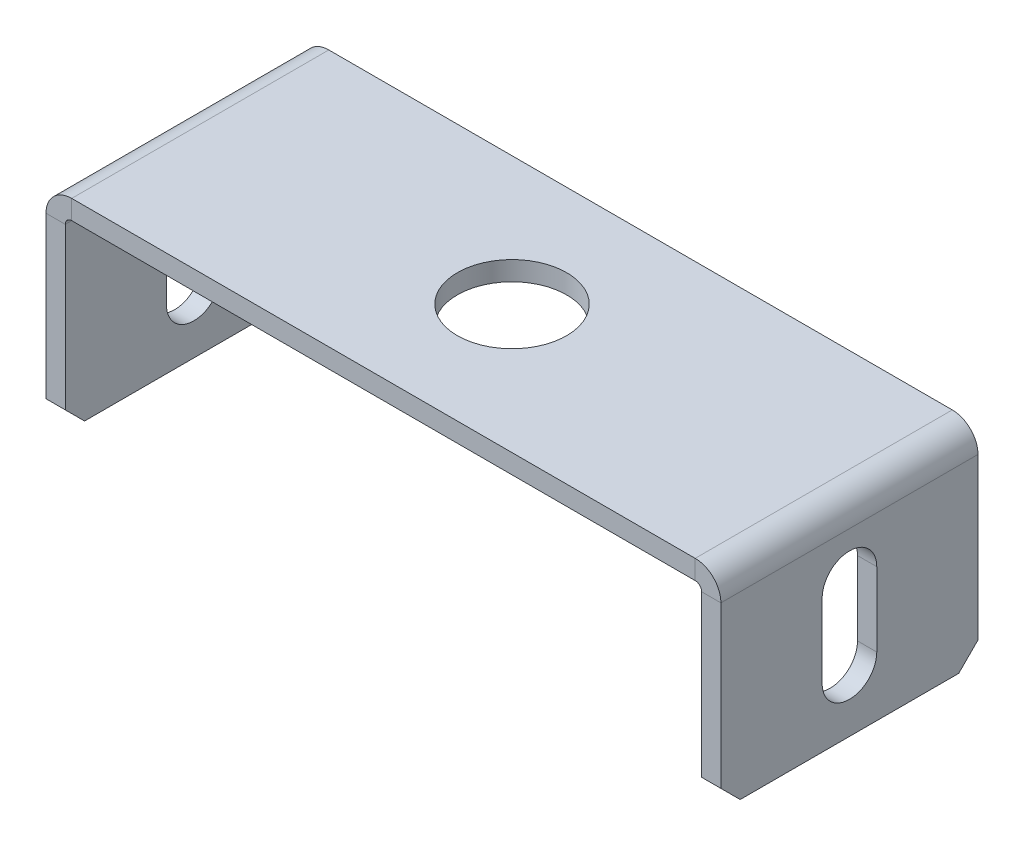
ISO-10303-21;
HEADER;
FILE_DESCRIPTION(('STEP AP214'),'2;1');
FILE_NAME('part.step','',(''),(''),'','','');
FILE_SCHEMA(('AUTOMOTIVE_DESIGN { 1 0 10303 214 1 1 1 1 }'));
ENDSEC;
DATA;
#1=APPLICATION_CONTEXT('core data for automotive mechanical design processes');
#2=APPLICATION_PROTOCOL_DEFINITION('international standard','automotive_design',2000,#1);
#3=PRODUCT_CONTEXT('',#1,'mechanical');
#4=PRODUCT('Part','Part','',(#3));
#5=PRODUCT_RELATED_PRODUCT_CATEGORY('part','',(#4));
#6=PRODUCT_DEFINITION_FORMATION('','',#4);
#7=PRODUCT_DEFINITION_CONTEXT('part definition',#1,'design');
#8=PRODUCT_DEFINITION('design','',#6,#7);
#9=PRODUCT_DEFINITION_SHAPE('','',#8);
#10=(LENGTH_UNIT() NAMED_UNIT(*) SI_UNIT(.MILLI.,.METRE.));
#11=(NAMED_UNIT(*) PLANE_ANGLE_UNIT() SI_UNIT($,.RADIAN.));
#12=(NAMED_UNIT(*) SI_UNIT($,.STERADIAN.) SOLID_ANGLE_UNIT());
#13=UNCERTAINTY_MEASURE_WITH_UNIT(LENGTH_MEASURE(1.E-05),#10,'distance_accuracy_value','');
#14=(GEOMETRIC_REPRESENTATION_CONTEXT(3) GLOBAL_UNCERTAINTY_ASSIGNED_CONTEXT((#13)) GLOBAL_UNIT_ASSIGNED_CONTEXT((#10,
#11,#12)) REPRESENTATION_CONTEXT('',''));
#15=CARTESIAN_POINT('',(0.,0.,0.));
#16=DIRECTION('',(0.,0.,1.));
#17=DIRECTION('',(1.,0.,0.));
#18=AXIS2_PLACEMENT_3D('',#15,#16,#17);
#19=CARTESIAN_POINT('',(-48.5,0.,20.));
#20=DIRECTION('',(0.,0.,1.));
#21=DIRECTION('',(1.,0.,0.));
#22=AXIS2_PLACEMENT_3D('',#19,#20,#21);
#23=PLANE('',#22);
#24=DIRECTION('',(0.,-1.,0.));
#25=VECTOR('',#24,1.);
#26=CARTESIAN_POINT('',(-48.5,0.,20.));
#27=LINE('',#26,#25);
#28=CARTESIAN_POINT('',(-48.5,0.,20.));
#29=VERTEX_POINT('',#28);
#30=CARTESIAN_POINT('',(-48.5,-3.,20.));
#31=VERTEX_POINT('',#30);
#32=EDGE_CURVE('E431',#29,#31,#27,.T.);
#33=ORIENTED_EDGE('',*,*,#32,.F.);
#34=CARTESIAN_POINT('',(-48.5,-4.,20.));
#35=DIRECTION('',(0.,0.,1.));
#36=DIRECTION('',(1.,0.,0.));
#37=AXIS2_PLACEMENT_3D('',#34,#35,#36);
#38=CIRCLE('',#37,4.);
#39=CARTESIAN_POINT('',(-52.5,-4.,20.));
#40=VERTEX_POINT('',#39);
#41=EDGE_CURVE('E341',#40,#29,#38,.F.);
#42=ORIENTED_EDGE('',*,*,#41,.F.);
#43=DIRECTION('',(-1.,0.,0.));
#44=VECTOR('',#43,1.);
#45=CARTESIAN_POINT('',(-49.5,-4.,20.));
#46=LINE('',#45,#44);
#47=CARTESIAN_POINT('',(-49.5,-4.,20.));
#48=VERTEX_POINT('',#47);
#49=EDGE_CURVE('E428',#48,#40,#46,.T.);
#50=ORIENTED_EDGE('',*,*,#49,.F.);
#51=CARTESIAN_POINT('',(-48.5,-4.,20.));
#52=DIRECTION('',(0.,0.,1.));
#53=DIRECTION('',(1.,0.,0.));
#54=AXIS2_PLACEMENT_3D('',#51,#52,#53);
#55=CIRCLE('',#54,1.);
#56=EDGE_CURVE('E348',#48,#31,#55,.F.);
#57=ORIENTED_EDGE('',*,*,#56,.T.);
#58=EDGE_LOOP('',(#33,#42,#50,#57));
#59=FACE_BOUND('',#58,.T.);
#60=ADVANCED_FACE('F112',(#59),#23,.T.);
#61=CARTESIAN_POINT('',(-49.5,-4.,20.));
#62=DIRECTION('',(0.,0.,1.));
#63=DIRECTION('',(1.,0.,0.));
#64=AXIS2_PLACEMENT_3D('',#61,#62,#63);
#65=PLANE('',#64);
#66=DIRECTION('',(1.,0.,0.));
#67=VECTOR('',#66,1.);
#68=CARTESIAN_POINT('',(-52.5,0.,20.));
#69=LINE('',#68,#67);
#70=CARTESIAN_POINT('',(48.5,0.,20.));
#71=VERTEX_POINT('',#70);
#72=EDGE_CURVE('E338',#29,#71,#69,.T.);
#73=ORIENTED_EDGE('',*,*,#72,.F.);
#74=ORIENTED_EDGE('',*,*,#32,.T.);
#75=DIRECTION('',(1.,0.,0.));
#76=VECTOR('',#75,1.);
#77=CARTESIAN_POINT('',(-52.5,-3.,20.));
#78=LINE('',#77,#76);
#79=CARTESIAN_POINT('',(48.5,-3.,20.));
#80=VERTEX_POINT('',#79);
#81=EDGE_CURVE('E351',#31,#80,#78,.T.);
#82=ORIENTED_EDGE('',*,*,#81,.T.);
#83=DIRECTION('',(0.,1.,0.));
#84=VECTOR('',#83,1.);
#85=CARTESIAN_POINT('',(48.5,-3.,20.));
#86=LINE('',#85,#84);
#87=EDGE_CURVE('E419',#80,#71,#86,.T.);
#88=ORIENTED_EDGE('',*,*,#87,.T.);
#89=EDGE_LOOP('',(#73,#74,#82,#88));
#90=FACE_BOUND('',#89,.T.);
#91=ADVANCED_FACE('F525',(#90),#65,.T.);
#92=CARTESIAN_POINT('',(-52.5,-4.,-20.));
#93=DIRECTION('',(0.,0.,-1.));
#94=DIRECTION('',(-1.,0.,0.));
#95=AXIS2_PLACEMENT_3D('',#92,#93,#94);
#96=PLANE('',#95);
#97=DIRECTION('',(1.,0.,0.));
#98=VECTOR('',#97,1.);
#99=CARTESIAN_POINT('',(-52.5,-4.,-20.));
#100=LINE('',#99,#98);
#101=CARTESIAN_POINT('',(-52.5,-4.,-20.));
#102=VERTEX_POINT('',#101);
#103=CARTESIAN_POINT('',(-49.5,-4.,-20.));
#104=VERTEX_POINT('',#103);
#105=EDGE_CURVE('E425',#102,#104,#100,.T.);
#106=ORIENTED_EDGE('',*,*,#105,.F.);
#107=CARTESIAN_POINT('',(-48.5,-4.,-20.));
#108=DIRECTION('',(0.,0.,1.));
#109=DIRECTION('',(1.,0.,0.));
#110=AXIS2_PLACEMENT_3D('',#107,#108,#109);
#111=CIRCLE('',#110,4.);
#112=CARTESIAN_POINT('',(-48.5,0.,-20.));
#113=VERTEX_POINT('',#112);
#114=EDGE_CURVE('E369',#102,#113,#111,.F.);
#115=ORIENTED_EDGE('',*,*,#114,.T.);
#116=DIRECTION('',(0.,1.,0.));
#117=VECTOR('',#116,1.);
#118=CARTESIAN_POINT('',(-48.5,-3.,-20.));
#119=LINE('',#118,#117);
#120=CARTESIAN_POINT('',(-48.5,-3.,-20.));
#121=VERTEX_POINT('',#120);
#122=EDGE_CURVE('E423',#121,#113,#119,.T.);
#123=ORIENTED_EDGE('',*,*,#122,.F.);
#124=CARTESIAN_POINT('',(-48.5,-4.,-20.));
#125=DIRECTION('',(0.,0.,1.));
#126=DIRECTION('',(1.,0.,0.));
#127=AXIS2_PLACEMENT_3D('',#124,#125,#126);
#128=CIRCLE('',#127,1.);
#129=EDGE_CURVE('E376',#104,#121,#128,.F.);
#130=ORIENTED_EDGE('',*,*,#129,.F.);
#131=EDGE_LOOP('',(#106,#115,#123,#130));
#132=FACE_BOUND('',#131,.T.);
#133=ADVANCED_FACE('F514',(#132),#96,.T.);
#134=CARTESIAN_POINT('',(-48.5,-3.,-20.));
#135=DIRECTION('',(0.,0.,-1.));
#136=DIRECTION('',(-1.,0.,0.));
#137=AXIS2_PLACEMENT_3D('',#134,#135,#136);
#138=PLANE('',#137);
#139=DIRECTION('',(0.,1.,0.));
#140=VECTOR('',#139,1.);
#141=CARTESIAN_POINT('',(-49.5,-32.,-20.));
#142=LINE('',#141,#140);
#143=CARTESIAN_POINT('',(-49.5,-29.,-20.));
#144=VERTEX_POINT('',#143);
#145=EDGE_CURVE('E374',#144,#104,#142,.T.);
#146=ORIENTED_EDGE('',*,*,#145,.F.);
#147=DIRECTION('',(-1.,0.,0.));
#148=VECTOR('',#147,1.);
#149=CARTESIAN_POINT('',(-48.5,-29.,-20.));
#150=LINE('',#149,#148);
#151=CARTESIAN_POINT('',(-52.5,-29.,-20.));
#152=VERTEX_POINT('',#151);
#153=EDGE_CURVE('E453',#144,#152,#150,.T.);
#154=ORIENTED_EDGE('',*,*,#153,.T.);
#155=DIRECTION('',(0.,1.,0.));
#156=VECTOR('',#155,1.);
#157=CARTESIAN_POINT('',(-52.5,-32.,-20.));
#158=LINE('',#157,#156);
#159=EDGE_CURVE('E372',#152,#102,#158,.T.);
#160=ORIENTED_EDGE('',*,*,#159,.T.);
#161=ORIENTED_EDGE('',*,*,#105,.T.);
#162=EDGE_LOOP('',(#146,#154,#160,#161));
#163=FACE_BOUND('',#162,.T.);
#164=ADVANCED_FACE('F601',(#163),#138,.T.);
#165=CARTESIAN_POINT('',(52.5,-4.,20.));
#166=DIRECTION('',(0.,0.,1.));
#167=DIRECTION('',(1.,0.,0.));
#168=AXIS2_PLACEMENT_3D('',#165,#166,#167);
#169=PLANE('',#168);
#170=DIRECTION('',(-1.,0.,0.));
#171=VECTOR('',#170,1.);
#172=CARTESIAN_POINT('',(52.5,-4.,20.));
#173=LINE('',#172,#171);
#174=CARTESIAN_POINT('',(52.5,-4.,20.));
#175=VERTEX_POINT('',#174);
#176=CARTESIAN_POINT('',(49.5,-4.,20.));
#177=VERTEX_POINT('',#176);
#178=EDGE_CURVE('E421',#175,#177,#173,.T.);
#179=ORIENTED_EDGE('',*,*,#178,.F.);
#180=CARTESIAN_POINT('',(48.5,-4.,20.));
#181=DIRECTION('',(0.,0.,1.));
#182=DIRECTION('',(1.,0.,0.));
#183=AXIS2_PLACEMENT_3D('',#180,#181,#182);
#184=CIRCLE('',#183,4.);
#185=EDGE_CURVE('E335',#71,#175,#184,.F.);
#186=ORIENTED_EDGE('',*,*,#185,.F.);
#187=ORIENTED_EDGE('',*,*,#87,.F.);
#188=CARTESIAN_POINT('',(48.5,-4.,20.));
#189=DIRECTION('',(0.,0.,1.));
#190=DIRECTION('',(1.,0.,0.));
#191=AXIS2_PLACEMENT_3D('',#188,#189,#190);
#192=CIRCLE('',#191,1.);
#193=EDGE_CURVE('E354',#80,#177,#192,.F.);
#194=ORIENTED_EDGE('',*,*,#193,.T.);
#195=EDGE_LOOP('',(#179,#186,#187,#194));
#196=FACE_BOUND('',#195,.T.);
#197=ADVANCED_FACE('F531',(#196),#169,.T.);
#198=CARTESIAN_POINT('',(48.5,-3.,20.));
#199=DIRECTION('',(0.,0.,1.));
#200=DIRECTION('',(1.,0.,0.));
#201=AXIS2_PLACEMENT_3D('',#198,#199,#200);
#202=PLANE('',#201);
#203=DIRECTION('',(0.,-1.,0.));
#204=VECTOR('',#203,1.);
#205=CARTESIAN_POINT('',(49.5,0.,20.));
#206=LINE('',#205,#204);
#207=CARTESIAN_POINT('',(49.5,-29.,20.));
#208=VERTEX_POINT('',#207);
#209=EDGE_CURVE('E328',#177,#208,#206,.T.);
#210=ORIENTED_EDGE('',*,*,#209,.T.);
#211=DIRECTION('',(1.,0.,0.));
#212=VECTOR('',#211,1.);
#213=CARTESIAN_POINT('',(48.5,-29.,20.));
#214=LINE('',#213,#212);
#215=CARTESIAN_POINT('',(52.5,-29.,20.));
#216=VERTEX_POINT('',#215);
#217=EDGE_CURVE('E449',#208,#216,#214,.T.);
#218=ORIENTED_EDGE('',*,*,#217,.T.);
#219=DIRECTION('',(0.,-1.,0.));
#220=VECTOR('',#219,1.);
#221=CARTESIAN_POINT('',(52.5,0.,20.));
#222=LINE('',#221,#220);
#223=EDGE_CURVE('E331',#175,#216,#222,.T.);
#224=ORIENTED_EDGE('',*,*,#223,.F.);
#225=ORIENTED_EDGE('',*,*,#178,.T.);
#226=EDGE_LOOP('',(#210,#218,#224,#225));
#227=FACE_BOUND('',#226,.T.);
#228=ADVANCED_FACE('F541',(#227),#202,.T.);
#229=CARTESIAN_POINT('',(48.5,0.,-20.));
#230=DIRECTION('',(0.,0.,-1.));
#231=DIRECTION('',(-1.,0.,0.));
#232=AXIS2_PLACEMENT_3D('',#229,#230,#231);
#233=PLANE('',#232);
#234=DIRECTION('',(0.,-1.,0.));
#235=VECTOR('',#234,1.);
#236=CARTESIAN_POINT('',(48.5,0.,-20.));
#237=LINE('',#236,#235);
#238=CARTESIAN_POINT('',(48.5,0.,-20.));
#239=VERTEX_POINT('',#238);
#240=CARTESIAN_POINT('',(48.5,-3.,-20.));
#241=VERTEX_POINT('',#240);
#242=EDGE_CURVE('E417',#239,#241,#237,.T.);
#243=ORIENTED_EDGE('',*,*,#242,.F.);
#244=CARTESIAN_POINT('',(48.5,-4.,-20.));
#245=DIRECTION('',(0.,0.,1.));
#246=DIRECTION('',(1.,0.,0.));
#247=AXIS2_PLACEMENT_3D('',#244,#245,#246);
#248=CIRCLE('',#247,4.);
#249=CARTESIAN_POINT('',(52.5,-4.,-20.));
#250=VERTEX_POINT('',#249);
#251=EDGE_CURVE('E363',#239,#250,#248,.F.);
#252=ORIENTED_EDGE('',*,*,#251,.T.);
#253=DIRECTION('',(1.,0.,0.));
#254=VECTOR('',#253,1.);
#255=CARTESIAN_POINT('',(49.5,-4.,-20.));
#256=LINE('',#255,#254);
#257=CARTESIAN_POINT('',(49.5,-4.,-20.));
#258=VERTEX_POINT('',#257);
#259=EDGE_CURVE('E415',#258,#250,#256,.T.);
#260=ORIENTED_EDGE('',*,*,#259,.F.);
#261=CARTESIAN_POINT('',(48.5,-4.,-20.));
#262=DIRECTION('',(0.,0.,1.));
#263=DIRECTION('',(1.,0.,0.));
#264=AXIS2_PLACEMENT_3D('',#261,#262,#263);
#265=CIRCLE('',#264,1.);
#266=EDGE_CURVE('E332',#241,#258,#265,.F.);
#267=ORIENTED_EDGE('',*,*,#266,.F.);
#268=EDGE_LOOP('',(#243,#252,#260,#267));
#269=FACE_BOUND('',#268,.T.);
#270=ADVANCED_FACE('F561',(#269),#233,.T.);
#271=CARTESIAN_POINT('',(49.5,-4.,-20.));
#272=DIRECTION('',(0.,0.,-1.));
#273=DIRECTION('',(-1.,0.,0.));
#274=AXIS2_PLACEMENT_3D('',#271,#272,#273);
#275=PLANE('',#274);
#276=DIRECTION('',(1.,0.,0.));
#277=VECTOR('',#276,1.);
#278=CARTESIAN_POINT('',(-52.5,0.,-20.));
#279=LINE('',#278,#277);
#280=EDGE_CURVE('E366',#113,#239,#279,.T.);
#281=ORIENTED_EDGE('',*,*,#280,.T.);
#282=ORIENTED_EDGE('',*,*,#242,.T.);
#283=DIRECTION('',(1.,0.,0.));
#284=VECTOR('',#283,1.);
#285=CARTESIAN_POINT('',(-52.5,-3.,-20.));
#286=LINE('',#285,#284);
#287=EDGE_CURVE('E379',#121,#241,#286,.T.);
#288=ORIENTED_EDGE('',*,*,#287,.F.);
#289=ORIENTED_EDGE('',*,*,#122,.T.);
#290=EDGE_LOOP('',(#281,#282,#288,#289));
#291=FACE_BOUND('',#290,.T.);
#292=ADVANCED_FACE('F567',(#291),#275,.T.);
#293=CARTESIAN_POINT('',(49.5,0.,20.));
#294=DIRECTION('',(1.,0.,0.));
#295=DIRECTION('',(0.,1.,0.));
#296=AXIS2_PLACEMENT_3D('',#293,#294,#295);
#297=PLANE('',#296);
#298=CARTESIAN_POINT('',(49.5,-22.75,0.));
#299=DIRECTION('',(1.,0.,0.));
#300=DIRECTION('',(0.,1.,0.));
#301=AXIS2_PLACEMENT_3D('',#298,#299,#300);
#302=CIRCLE('',#301,4.24999999999999);
#303=CARTESIAN_POINT('',(49.5,-22.75,4.24999999999999));
#304=VERTEX_POINT('',#303);
#305=CARTESIAN_POINT('',(49.5,-22.75,-4.24999999999999));
#306=VERTEX_POINT('',#305);
#307=EDGE_CURVE('E324',#304,#306,#302,.T.);
#308=ORIENTED_EDGE('',*,*,#307,.T.);
#309=DIRECTION('',(0.,1.,0.));
#310=VECTOR('',#309,1.);
#311=CARTESIAN_POINT('',(49.5,0.,-4.24999999999999));
#312=LINE('',#311,#310);
#313=CARTESIAN_POINT('',(49.5,-11.25,-4.24999999999999));
#314=VERTEX_POINT('',#313);
#315=EDGE_CURVE('E315',#306,#314,#312,.T.);
#316=ORIENTED_EDGE('',*,*,#315,.T.);
#317=CARTESIAN_POINT('',(49.5,-11.25,0.));
#318=DIRECTION('',(1.,0.,0.));
#319=DIRECTION('',(0.,1.,0.));
#320=AXIS2_PLACEMENT_3D('',#317,#318,#319);
#321=CIRCLE('',#320,4.24999999999999);
#322=CARTESIAN_POINT('',(49.5,-11.25,4.24999999999999));
#323=VERTEX_POINT('',#322);
#324=EDGE_CURVE('E321',#314,#323,#321,.T.);
#325=ORIENTED_EDGE('',*,*,#324,.T.);
#326=DIRECTION('',(0.,-1.,0.));
#327=VECTOR('',#326,1.);
#328=CARTESIAN_POINT('',(49.5,0.,4.25));
#329=LINE('',#328,#327);
#330=EDGE_CURVE('E318',#323,#304,#329,.T.);
#331=ORIENTED_EDGE('',*,*,#330,.T.);
#332=EDGE_LOOP('',(#308,#316,#325,#331));
#333=FACE_BOUND('',#332,.T.);
#334=DIRECTION('',(0.,0.,-1.));
#335=VECTOR('',#334,1.);
#336=CARTESIAN_POINT('',(49.5,-32.,20.));
#337=LINE('',#336,#335);
#338=CARTESIAN_POINT('',(49.5,-32.,17.));
#339=VERTEX_POINT('',#338);
#340=CARTESIAN_POINT('',(49.5,-32.,-17.));
#341=VERTEX_POINT('',#340);
#342=EDGE_CURVE('E413',#339,#341,#337,.T.);
#343=ORIENTED_EDGE('',*,*,#342,.F.);
#344=DIRECTION('',(0.,-0.707106781186548,-0.707106781186548));
#345=VECTOR('',#344,1.);
#346=CARTESIAN_POINT('',(49.5,-32.,17.));
#347=LINE('',#346,#345);
#348=EDGE_CURVE('E447',#339,#208,#347,.F.);
#349=ORIENTED_EDGE('',*,*,#348,.T.);
#350=ORIENTED_EDGE('',*,*,#209,.F.);
#351=DIRECTION('',(0.,0.,-1.));
#352=VECTOR('',#351,1.);
#353=CARTESIAN_POINT('',(49.5,-4.,20.));
#354=LINE('',#353,#352);
#355=EDGE_CURVE('E357',#177,#258,#354,.T.);
#356=ORIENTED_EDGE('',*,*,#355,.T.);
#357=DIRECTION('',(0.,-1.,0.));
#358=VECTOR('',#357,1.);
#359=CARTESIAN_POINT('',(49.5,0.,-20.));
#360=LINE('',#359,#358);
#361=CARTESIAN_POINT('',(49.5,-29.,-20.));
#362=VERTEX_POINT('',#361);
#363=EDGE_CURVE('E327',#258,#362,#360,.T.);
#364=ORIENTED_EDGE('',*,*,#363,.T.);
#365=DIRECTION('',(0.,-0.707106781186548,0.707106781186547));
#366=VECTOR('',#365,1.);
#367=CARTESIAN_POINT('',(49.5,-29.,-20.));
#368=LINE('',#367,#366);
#369=EDGE_CURVE('E436',#362,#341,#368,.T.);
#370=ORIENTED_EDGE('',*,*,#369,.T.);
#371=EDGE_LOOP('',(#343,#349,#350,#356,#364,#370));
#372=FACE_BOUND('',#371,.T.);
#373=ADVANCED_FACE('F565',(#333,#372),#297,.F.);
#374=CARTESIAN_POINT('',(52.5,-32.,20.));
#375=DIRECTION('',(0.,-1.,0.));
#376=DIRECTION('',(0.,0.,-1.));
#377=AXIS2_PLACEMENT_3D('',#374,#375,#376);
#378=PLANE('',#377);
#379=DIRECTION('',(0.,0.,-1.));
#380=VECTOR('',#379,1.);
#381=CARTESIAN_POINT('',(52.5,-32.,20.));
#382=LINE('',#381,#380);
#383=CARTESIAN_POINT('',(52.5,-32.,17.));
#384=VERTEX_POINT('',#383);
#385=CARTESIAN_POINT('',(52.5,-32.,-17.));
#386=VERTEX_POINT('',#385);
#387=EDGE_CURVE('E411',#384,#386,#382,.T.);
#388=ORIENTED_EDGE('',*,*,#387,.F.);
#389=DIRECTION('',(-1.,0.,0.));
#390=VECTOR('',#389,1.);
#391=CARTESIAN_POINT('',(52.5,-32.,17.));
#392=LINE('',#391,#390);
#393=EDGE_CURVE('E444',#384,#339,#392,.T.);
#394=ORIENTED_EDGE('',*,*,#393,.T.);
#395=ORIENTED_EDGE('',*,*,#342,.T.);
#396=DIRECTION('',(1.,0.,0.));
#397=VECTOR('',#396,1.);
#398=CARTESIAN_POINT('',(52.5,-32.,-17.));
#399=LINE('',#398,#397);
#400=EDGE_CURVE('E439',#341,#386,#399,.T.);
#401=ORIENTED_EDGE('',*,*,#400,.T.);
#402=EDGE_LOOP('',(#388,#394,#395,#401));
#403=FACE_BOUND('',#402,.T.);
#404=ADVANCED_FACE('F549',(#403),#378,.T.);
#405=CARTESIAN_POINT('',(52.5,0.,20.));
#406=DIRECTION('',(1.,0.,0.));
#407=DIRECTION('',(0.,1.,0.));
#408=AXIS2_PLACEMENT_3D('',#405,#406,#407);
#409=PLANE('',#408);
#410=DIRECTION('',(0.,1.,0.));
#411=VECTOR('',#410,1.);
#412=CARTESIAN_POINT('',(52.5,-22.75,-4.25000000000001));
#413=LINE('',#412,#411);
#414=CARTESIAN_POINT('',(52.5,-22.75,-4.25));
#415=VERTEX_POINT('',#414);
#416=CARTESIAN_POINT('',(52.5,-11.25,-4.25));
#417=VERTEX_POINT('',#416);
#418=EDGE_CURVE('E280',#415,#417,#413,.T.);
#419=ORIENTED_EDGE('',*,*,#418,.F.);
#420=CARTESIAN_POINT('',(52.5,-22.75,0.));
#421=DIRECTION('',(1.,0.,0.));
#422=DIRECTION('',(0.,0.,-1.));
#423=AXIS2_PLACEMENT_3D('',#420,#421,#422);
#424=CIRCLE('',#423,4.25);
#425=CARTESIAN_POINT('',(52.5,-22.75,4.25));
#426=VERTEX_POINT('',#425);
#427=EDGE_CURVE('E294',#426,#415,#424,.T.);
#428=ORIENTED_EDGE('',*,*,#427,.F.);
#429=DIRECTION('',(0.,1.,0.));
#430=VECTOR('',#429,1.);
#431=CARTESIAN_POINT('',(52.5,-22.75,4.25));
#432=LINE('',#431,#430);
#433=CARTESIAN_POINT('',(52.5,-11.25,4.25));
#434=VERTEX_POINT('',#433);
#435=EDGE_CURVE('E296',#426,#434,#432,.T.);
#436=ORIENTED_EDGE('',*,*,#435,.T.);
#437=CARTESIAN_POINT('',(52.5,-11.25,0.));
#438=DIRECTION('',(1.,0.,0.));
#439=DIRECTION('',(0.,0.,-1.));
#440=AXIS2_PLACEMENT_3D('',#437,#438,#439);
#441=CIRCLE('',#440,4.25);
#442=EDGE_CURVE('E303',#417,#434,#441,.T.);
#443=ORIENTED_EDGE('',*,*,#442,.F.);
#444=EDGE_LOOP('',(#419,#428,#436,#443));
#445=FACE_BOUND('',#444,.T.);
#446=ORIENTED_EDGE('',*,*,#223,.T.);
#447=DIRECTION('',(0.,0.707106781186548,0.707106781186548));
#448=VECTOR('',#447,1.);
#449=CARTESIAN_POINT('',(52.5,-14.5,34.5));
#450=LINE('',#449,#448);
#451=EDGE_CURVE('E451',#216,#384,#450,.F.);
#452=ORIENTED_EDGE('',*,*,#451,.T.);
#453=ORIENTED_EDGE('',*,*,#387,.T.);
#454=DIRECTION('',(0.,0.707106781186548,-0.707106781186547));
#455=VECTOR('',#454,1.);
#456=CARTESIAN_POINT('',(52.5,-34.5,-14.5));
#457=LINE('',#456,#455);
#458=CARTESIAN_POINT('',(52.5,-29.,-20.));
#459=VERTEX_POINT('',#458);
#460=EDGE_CURVE('E442',#386,#459,#457,.T.);
#461=ORIENTED_EDGE('',*,*,#460,.T.);
#462=DIRECTION('',(0.,-1.,0.));
#463=VECTOR('',#462,1.);
#464=CARTESIAN_POINT('',(52.5,0.,-20.));
#465=LINE('',#464,#463);
#466=EDGE_CURVE('E360',#250,#459,#465,.T.);
#467=ORIENTED_EDGE('',*,*,#466,.F.);
#468=DIRECTION('',(0.,0.,-1.));
#469=VECTOR('',#468,1.);
#470=CARTESIAN_POINT('',(52.5,-4.,20.));
#471=LINE('',#470,#469);
#472=EDGE_CURVE('E408',#175,#250,#471,.T.);
#473=ORIENTED_EDGE('',*,*,#472,.F.);
#474=EDGE_LOOP('',(#446,#452,#453,#461,#467,#473));
#475=FACE_BOUND('',#474,.T.);
#476=ADVANCED_FACE('F539',(#445,#475),#409,.T.);
#477=CARTESIAN_POINT('',(48.5,-4.,20.));
#478=DIRECTION('',(0.,0.,-1.));
#479=DIRECTION('',(-1.,0.,0.));
#480=AXIS2_PLACEMENT_3D('',#477,#478,#479);
#481=CYLINDRICAL_SURFACE('',#480,4.);
#482=ORIENTED_EDGE('',*,*,#251,.F.);
#483=DIRECTION('',(0.,0.,-1.));
#484=VECTOR('',#483,1.);
#485=CARTESIAN_POINT('',(48.5,0.,20.));
#486=LINE('',#485,#484);
#487=EDGE_CURVE('E405',#71,#239,#486,.T.);
#488=ORIENTED_EDGE('',*,*,#487,.F.);
#489=ORIENTED_EDGE('',*,*,#185,.T.);
#490=ORIENTED_EDGE('',*,*,#472,.T.);
#491=EDGE_LOOP('',(#482,#488,#489,#490));
#492=FACE_BOUND('',#491,.T.);
#493=ADVANCED_FACE('F503',(#492),#481,.T.);
#494=CARTESIAN_POINT('',(-52.5,0.,20.));
#495=DIRECTION('',(0.,1.,0.));
#496=DIRECTION('',(0.,0.,1.));
#497=AXIS2_PLACEMENT_3D('',#494,#495,#496);
#498=PLANE('',#497);
#499=CARTESIAN_POINT('',(0.,0.,0.));
#500=DIRECTION('',(0.,1.,0.));
#501=DIRECTION('',(0.,0.,1.));
#502=AXIS2_PLACEMENT_3D('',#499,#500,#501);
#503=CIRCLE('',#502,8.5);
#504=CARTESIAN_POINT('',(0.,0.,8.5));
#505=VERTEX_POINT('',#504);
#506=EDGE_CURVE('E492',#505,#505,#503,.T.);
#507=ORIENTED_EDGE('',*,*,#506,.F.);
#508=EDGE_LOOP('',(#507));
#509=FACE_BOUND('',#508,.T.);
#510=ORIENTED_EDGE('',*,*,#280,.F.);
#511=DIRECTION('',(0.,0.,-1.));
#512=VECTOR('',#511,1.);
#513=CARTESIAN_POINT('',(-48.5,0.,20.));
#514=LINE('',#513,#512);
#515=EDGE_CURVE('E402',#29,#113,#514,.T.);
#516=ORIENTED_EDGE('',*,*,#515,.F.);
#517=ORIENTED_EDGE('',*,*,#72,.T.);
#518=ORIENTED_EDGE('',*,*,#487,.T.);
#519=EDGE_LOOP('',(#510,#516,#517,#518));
#520=FACE_BOUND('',#519,.T.);
#521=ADVANCED_FACE('F499',(#509,#520),#498,.T.);
#522=CARTESIAN_POINT('',(-48.5,-4.,20.));
#523=DIRECTION('',(0.,0.,-1.));
#524=DIRECTION('',(-1.,0.,0.));
#525=AXIS2_PLACEMENT_3D('',#522,#523,#524);
#526=CYLINDRICAL_SURFACE('',#525,4.);
#527=ORIENTED_EDGE('',*,*,#114,.F.);
#528=DIRECTION('',(0.,0.,-1.));
#529=VECTOR('',#528,1.);
#530=CARTESIAN_POINT('',(-52.5,-4.,20.));
#531=LINE('',#530,#529);
#532=EDGE_CURVE('E399',#40,#102,#531,.T.);
#533=ORIENTED_EDGE('',*,*,#532,.F.);
#534=ORIENTED_EDGE('',*,*,#41,.T.);
#535=ORIENTED_EDGE('',*,*,#515,.T.);
#536=EDGE_LOOP('',(#527,#533,#534,#535));
#537=FACE_BOUND('',#536,.T.);
#538=ADVANCED_FACE('F502',(#537),#526,.T.);
#539=CARTESIAN_POINT('',(-52.5,-32.,20.));
#540=DIRECTION('',(-1.,0.,0.));
#541=DIRECTION('',(0.,-1.,0.));
#542=AXIS2_PLACEMENT_3D('',#539,#540,#541);
#543=PLANE('',#542);
#544=DIRECTION('',(0.,1.,0.));
#545=VECTOR('',#544,1.);
#546=CARTESIAN_POINT('',(-52.5,-22.75,-4.24999999999999));
#547=LINE('',#546,#545);
#548=CARTESIAN_POINT('',(-52.5,-22.75,-4.24999999999999));
#549=VERTEX_POINT('',#548);
#550=CARTESIAN_POINT('',(-52.5,-11.25,-4.24999999999999));
#551=VERTEX_POINT('',#550);
#552=EDGE_CURVE('E271',#549,#551,#547,.T.);
#553=ORIENTED_EDGE('',*,*,#552,.T.);
#554=CARTESIAN_POINT('',(-52.5,-11.25,0.));
#555=DIRECTION('',(1.,0.,0.));
#556=DIRECTION('',(0.,0.,-1.));
#557=AXIS2_PLACEMENT_3D('',#554,#555,#556);
#558=CIRCLE('',#557,4.24999999999999);
#559=CARTESIAN_POINT('',(-52.5,-11.25,4.24999999999999));
#560=VERTEX_POINT('',#559);
#561=EDGE_CURVE('E306',#551,#560,#558,.T.);
#562=ORIENTED_EDGE('',*,*,#561,.T.);
#563=DIRECTION('',(0.,1.,0.));
#564=VECTOR('',#563,1.);
#565=CARTESIAN_POINT('',(-52.5,-22.75,4.24999999999999));
#566=LINE('',#565,#564);
#567=CARTESIAN_POINT('',(-52.5,-22.75,4.24999999999999));
#568=VERTEX_POINT('',#567);
#569=EDGE_CURVE('E279',#568,#560,#566,.T.);
#570=ORIENTED_EDGE('',*,*,#569,.F.);
#571=CARTESIAN_POINT('',(-52.5,-22.75,0.));
#572=DIRECTION('',(1.,0.,0.));
#573=DIRECTION('',(0.,0.,-1.));
#574=AXIS2_PLACEMENT_3D('',#571,#572,#573);
#575=CIRCLE('',#574,4.24999999999999);
#576=EDGE_CURVE('E285',#568,#549,#575,.T.);
#577=ORIENTED_EDGE('',*,*,#576,.T.);
#578=EDGE_LOOP('',(#553,#562,#570,#577));
#579=FACE_BOUND('',#578,.T.);
#580=DIRECTION('',(0.,0.,-1.));
#581=VECTOR('',#580,1.);
#582=CARTESIAN_POINT('',(-52.5,-32.,20.));
#583=LINE('',#582,#581);
#584=CARTESIAN_POINT('',(-52.5,-32.,17.));
#585=VERTEX_POINT('',#584);
#586=CARTESIAN_POINT('',(-52.5,-32.,-17.));
#587=VERTEX_POINT('',#586);
#588=EDGE_CURVE('E397',#585,#587,#583,.T.);
#589=ORIENTED_EDGE('',*,*,#588,.F.);
#590=DIRECTION('',(0.,-0.707106781186548,-0.707106781186548));
#591=VECTOR('',#590,1.);
#592=CARTESIAN_POINT('',(-52.5,-30.5,18.5));
#593=LINE('',#592,#591);
#594=CARTESIAN_POINT('',(-52.5,-29.,20.));
#595=VERTEX_POINT('',#594);
#596=EDGE_CURVE('E467',#585,#595,#593,.F.);
#597=ORIENTED_EDGE('',*,*,#596,.T.);
#598=DIRECTION('',(0.,1.,0.));
#599=VECTOR('',#598,1.);
#600=CARTESIAN_POINT('',(-52.5,-32.,20.));
#601=LINE('',#600,#599);
#602=EDGE_CURVE('E344',#595,#40,#601,.T.);
#603=ORIENTED_EDGE('',*,*,#602,.T.);
#604=ORIENTED_EDGE('',*,*,#532,.T.);
#605=ORIENTED_EDGE('',*,*,#159,.F.);
#606=DIRECTION('',(0.,0.707106781186548,-0.707106781186547));
#607=VECTOR('',#606,1.);
#608=CARTESIAN_POINT('',(-52.5,-50.5,1.49999999999998));
#609=LINE('',#608,#607);
#610=EDGE_CURVE('E456',#152,#587,#609,.F.);
#611=ORIENTED_EDGE('',*,*,#610,.T.);
#612=EDGE_LOOP('',(#589,#597,#603,#604,#605,#611));
#613=FACE_BOUND('',#612,.T.);
#614=ADVANCED_FACE('F292',(#579,#613),#543,.T.);
#615=CARTESIAN_POINT('',(-49.5,-32.,20.));
#616=DIRECTION('',(0.,-1.,0.));
#617=DIRECTION('',(0.,0.,-1.));
#618=AXIS2_PLACEMENT_3D('',#615,#616,#617);
#619=PLANE('',#618);
#620=DIRECTION('',(0.,0.,-1.));
#621=VECTOR('',#620,1.);
#622=CARTESIAN_POINT('',(-49.5,-32.,20.));
#623=LINE('',#622,#621);
#624=CARTESIAN_POINT('',(-49.5,-32.,17.));
#625=VERTEX_POINT('',#624);
#626=CARTESIAN_POINT('',(-49.5,-32.,-17.));
#627=VERTEX_POINT('',#626);
#628=EDGE_CURVE('E395',#625,#627,#623,.T.);
#629=ORIENTED_EDGE('',*,*,#628,.F.);
#630=DIRECTION('',(-1.,0.,0.));
#631=VECTOR('',#630,1.);
#632=CARTESIAN_POINT('',(-49.5,-32.,17.));
#633=LINE('',#632,#631);
#634=EDGE_CURVE('E464',#625,#585,#633,.T.);
#635=ORIENTED_EDGE('',*,*,#634,.T.);
#636=ORIENTED_EDGE('',*,*,#588,.T.);
#637=DIRECTION('',(1.,0.,0.));
#638=VECTOR('',#637,1.);
#639=CARTESIAN_POINT('',(-49.5,-32.,-17.));
#640=LINE('',#639,#638);
#641=EDGE_CURVE('E459',#587,#627,#640,.T.);
#642=ORIENTED_EDGE('',*,*,#641,.T.);
#643=EDGE_LOOP('',(#629,#635,#636,#642));
#644=FACE_BOUND('',#643,.T.);
#645=ADVANCED_FACE('F611',(#644),#619,.T.);
#646=CARTESIAN_POINT('',(-49.5,-32.,20.));
#647=DIRECTION('',(-1.,0.,0.));
#648=DIRECTION('',(0.,-1.,0.));
#649=AXIS2_PLACEMENT_3D('',#646,#647,#648);
#650=PLANE('',#649);
#651=CARTESIAN_POINT('',(-49.5,-22.75,0.));
#652=DIRECTION('',(-1.,0.,0.));
#653=DIRECTION('',(0.,-1.,0.));
#654=AXIS2_PLACEMENT_3D('',#651,#652,#653);
#655=CIRCLE('',#654,4.24999999999999);
#656=CARTESIAN_POINT('',(-49.5,-22.75,-4.24999999999999));
#657=VERTEX_POINT('',#656);
#658=CARTESIAN_POINT('',(-49.5,-22.75,4.24999999999999));
#659=VERTEX_POINT('',#658);
#660=EDGE_CURVE('E120',#657,#659,#655,.T.);
#661=ORIENTED_EDGE('',*,*,#660,.T.);
#662=DIRECTION('',(0.,1.,0.));
#663=VECTOR('',#662,1.);
#664=CARTESIAN_POINT('',(-49.5,-32.,4.24999999999999));
#665=LINE('',#664,#663);
#666=CARTESIAN_POINT('',(-49.5,-11.25,4.24999999999999));
#667=VERTEX_POINT('',#666);
#668=EDGE_CURVE('E13',#659,#667,#665,.T.);
#669=ORIENTED_EDGE('',*,*,#668,.T.);
#670=CARTESIAN_POINT('',(-49.5,-11.25,0.));
#671=DIRECTION('',(-1.,0.,0.));
#672=DIRECTION('',(0.,-1.,0.));
#673=AXIS2_PLACEMENT_3D('',#670,#671,#672);
#674=CIRCLE('',#673,4.24999999999999);
#675=CARTESIAN_POINT('',(-49.5,-11.25,-4.24999999999999));
#676=VERTEX_POINT('',#675);
#677=EDGE_CURVE('E475',#667,#676,#674,.T.);
#678=ORIENTED_EDGE('',*,*,#677,.T.);
#679=DIRECTION('',(0.,-1.,0.));
#680=VECTOR('',#679,1.);
#681=CARTESIAN_POINT('',(-49.5,-32.,-4.24999999999999));
#682=LINE('',#681,#680);
#683=EDGE_CURVE('E473',#676,#657,#682,.T.);
#684=ORIENTED_EDGE('',*,*,#683,.T.);
#685=EDGE_LOOP('',(#661,#669,#678,#684));
#686=FACE_BOUND('',#685,.T.);
#687=DIRECTION('',(0.,1.,0.));
#688=VECTOR('',#687,1.);
#689=CARTESIAN_POINT('',(-49.5,-32.,20.));
#690=LINE('',#689,#688);
#691=CARTESIAN_POINT('',(-49.5,-29.,20.));
#692=VERTEX_POINT('',#691);
#693=EDGE_CURVE('E346',#692,#48,#690,.T.);
#694=ORIENTED_EDGE('',*,*,#693,.F.);
#695=DIRECTION('',(0.,0.707106781186548,0.707106781186548));
#696=VECTOR('',#695,1.);
#697=CARTESIAN_POINT('',(-49.5,-32.,17.));
#698=LINE('',#697,#696);
#699=EDGE_CURVE('E471',#692,#625,#698,.F.);
#700=ORIENTED_EDGE('',*,*,#699,.T.);
#701=ORIENTED_EDGE('',*,*,#628,.T.);
#702=DIRECTION('',(0.,-0.707106781186548,0.707106781186547));
#703=VECTOR('',#702,1.);
#704=CARTESIAN_POINT('',(-49.5,-29.,-20.));
#705=LINE('',#704,#703);
#706=EDGE_CURVE('E462',#627,#144,#705,.F.);
#707=ORIENTED_EDGE('',*,*,#706,.T.);
#708=ORIENTED_EDGE('',*,*,#145,.T.);
#709=DIRECTION('',(0.,0.,-1.));
#710=VECTOR('',#709,1.);
#711=CARTESIAN_POINT('',(-49.5,-4.,20.));
#712=LINE('',#711,#710);
#713=EDGE_CURVE('E392',#48,#104,#712,.T.);
#714=ORIENTED_EDGE('',*,*,#713,.F.);
#715=EDGE_LOOP('',(#694,#700,#701,#707,#708,#714));
#716=FACE_BOUND('',#715,.T.);
#717=ADVANCED_FACE('F478',(#686,#716),#650,.F.);
#718=CARTESIAN_POINT('',(-48.5,-4.,20.));
#719=DIRECTION('',(0.,0.,-1.));
#720=DIRECTION('',(-1.,0.,0.));
#721=AXIS2_PLACEMENT_3D('',#718,#719,#720);
#722=CYLINDRICAL_SURFACE('',#721,1.);
#723=ORIENTED_EDGE('',*,*,#129,.T.);
#724=DIRECTION('',(0.,0.,-1.));
#725=VECTOR('',#724,1.);
#726=CARTESIAN_POINT('',(-48.5,-3.,20.));
#727=LINE('',#726,#725);
#728=EDGE_CURVE('E389',#31,#121,#727,.T.);
#729=ORIENTED_EDGE('',*,*,#728,.F.);
#730=ORIENTED_EDGE('',*,*,#56,.F.);
#731=ORIENTED_EDGE('',*,*,#713,.T.);
#732=EDGE_LOOP('',(#723,#729,#730,#731));
#733=FACE_BOUND('',#732,.T.);
#734=ADVANCED_FACE('F604',(#733),#722,.F.);
#735=CARTESIAN_POINT('',(-52.5,-3.,20.));
#736=DIRECTION('',(0.,1.,0.));
#737=DIRECTION('',(0.,0.,1.));
#738=AXIS2_PLACEMENT_3D('',#735,#736,#737);
#739=PLANE('',#738);
#740=CARTESIAN_POINT('',(0.,-3.,0.));
#741=DIRECTION('',(0.,1.,0.));
#742=DIRECTION('',(0.,0.,1.));
#743=AXIS2_PLACEMENT_3D('',#740,#741,#742);
#744=CIRCLE('',#743,8.49999999999999);
#745=CARTESIAN_POINT('',(0.,-3.,8.49999999999999));
#746=VERTEX_POINT('',#745);
#747=EDGE_CURVE('E489',#746,#746,#744,.T.);
#748=ORIENTED_EDGE('',*,*,#747,.T.);
#749=EDGE_LOOP('',(#748));
#750=FACE_BOUND('',#749,.T.);
#751=ORIENTED_EDGE('',*,*,#287,.T.);
#752=DIRECTION('',(0.,0.,-1.));
#753=VECTOR('',#752,1.);
#754=CARTESIAN_POINT('',(48.5,-3.,20.));
#755=LINE('',#754,#753);
#756=EDGE_CURVE('E386',#80,#241,#755,.T.);
#757=ORIENTED_EDGE('',*,*,#756,.F.);
#758=ORIENTED_EDGE('',*,*,#81,.F.);
#759=ORIENTED_EDGE('',*,*,#728,.T.);
#760=EDGE_LOOP('',(#751,#757,#758,#759));
#761=FACE_BOUND('',#760,.T.);
#762=ADVANCED_FACE('F621',(#750,#761),#739,.F.);
#763=CARTESIAN_POINT('',(48.5,-4.,20.));
#764=DIRECTION('',(0.,0.,-1.));
#765=DIRECTION('',(-1.,0.,0.));
#766=AXIS2_PLACEMENT_3D('',#763,#764,#765);
#767=CYLINDRICAL_SURFACE('',#766,1.);
#768=ORIENTED_EDGE('',*,*,#266,.T.);
#769=ORIENTED_EDGE('',*,*,#355,.F.);
#770=ORIENTED_EDGE('',*,*,#193,.F.);
#771=ORIENTED_EDGE('',*,*,#756,.T.);
#772=EDGE_LOOP('',(#768,#769,#770,#771));
#773=FACE_BOUND('',#772,.T.);
#774=ADVANCED_FACE('F563',(#773),#767,.F.);
#775=CARTESIAN_POINT('',(48.5,-4.,20.));
#776=DIRECTION('',(0.,0.,1.));
#777=DIRECTION('',(1.,0.,0.));
#778=AXIS2_PLACEMENT_3D('',#775,#776,#777);
#779=PLANE('',#778);
#780=ORIENTED_EDGE('',*,*,#602,.F.);
#781=DIRECTION('',(1.,0.,0.));
#782=VECTOR('',#781,1.);
#783=CARTESIAN_POINT('',(48.5,-29.,20.));
#784=LINE('',#783,#782);
#785=EDGE_CURVE('E469',#595,#692,#784,.T.);
#786=ORIENTED_EDGE('',*,*,#785,.T.);
#787=ORIENTED_EDGE('',*,*,#693,.T.);
#788=ORIENTED_EDGE('',*,*,#49,.T.);
#789=EDGE_LOOP('',(#780,#786,#787,#788));
#790=FACE_BOUND('',#789,.T.);
#791=ADVANCED_FACE('F613',(#790),#779,.T.);
#792=CARTESIAN_POINT('',(48.5,-4.,-20.));
#793=DIRECTION('',(0.,0.,1.));
#794=DIRECTION('',(1.,0.,0.));
#795=AXIS2_PLACEMENT_3D('',#792,#793,#794);
#796=PLANE('',#795);
#797=ORIENTED_EDGE('',*,*,#466,.T.);
#798=DIRECTION('',(-1.,0.,0.));
#799=VECTOR('',#798,1.);
#800=CARTESIAN_POINT('',(49.5,-29.,-20.));
#801=LINE('',#800,#799);
#802=EDGE_CURVE('E433',#459,#362,#801,.T.);
#803=ORIENTED_EDGE('',*,*,#802,.T.);
#804=ORIENTED_EDGE('',*,*,#363,.F.);
#805=ORIENTED_EDGE('',*,*,#259,.T.);
#806=EDGE_LOOP('',(#797,#803,#804,#805));
#807=FACE_BOUND('',#806,.T.);
#808=ADVANCED_FACE('F557',(#807),#796,.F.);
#809=CARTESIAN_POINT('',(48.5,-29.,-20.));
#810=DIRECTION('',(0.,-0.707106781186547,-0.707106781186548));
#811=DIRECTION('',(1.,0.,0.));
#812=AXIS2_PLACEMENT_3D('',#809,#810,#811);
#813=PLANE('',#812);
#814=ORIENTED_EDGE('',*,*,#460,.F.);
#815=ORIENTED_EDGE('',*,*,#400,.F.);
#816=ORIENTED_EDGE('',*,*,#369,.F.);
#817=ORIENTED_EDGE('',*,*,#802,.F.);
#818=EDGE_LOOP('',(#814,#815,#816,#817));
#819=FACE_BOUND('',#818,.T.);
#820=ADVANCED_FACE('F555',(#819),#813,.T.);
#821=CARTESIAN_POINT('',(52.5,-32.,17.));
#822=DIRECTION('',(0.,0.707106781186548,-0.707106781186548));
#823=DIRECTION('',(-1.,0.,0.));
#824=AXIS2_PLACEMENT_3D('',#821,#822,#823);
#825=PLANE('',#824);
#826=ORIENTED_EDGE('',*,*,#451,.F.);
#827=ORIENTED_EDGE('',*,*,#217,.F.);
#828=ORIENTED_EDGE('',*,*,#348,.F.);
#829=ORIENTED_EDGE('',*,*,#393,.F.);
#830=EDGE_LOOP('',(#826,#827,#828,#829));
#831=FACE_BOUND('',#830,.T.);
#832=ADVANCED_FACE('F545',(#831),#825,.F.);
#833=CARTESIAN_POINT('',(-48.5,-29.,-20.));
#834=DIRECTION('',(0.,0.707106781186547,0.707106781186548));
#835=DIRECTION('',(-1.,0.,0.));
#836=AXIS2_PLACEMENT_3D('',#833,#834,#835);
#837=PLANE('',#836);
#838=ORIENTED_EDGE('',*,*,#706,.F.);
#839=ORIENTED_EDGE('',*,*,#641,.F.);
#840=ORIENTED_EDGE('',*,*,#610,.F.);
#841=ORIENTED_EDGE('',*,*,#153,.F.);
#842=EDGE_LOOP('',(#838,#839,#840,#841));
#843=FACE_BOUND('',#842,.T.);
#844=ADVANCED_FACE('F587',(#843),#837,.F.);
#845=CARTESIAN_POINT('',(-49.5,-32.,17.));
#846=DIRECTION('',(0.,0.707106781186548,-0.707106781186548));
#847=DIRECTION('',(-1.,0.,0.));
#848=AXIS2_PLACEMENT_3D('',#845,#846,#847);
#849=PLANE('',#848);
#850=ORIENTED_EDGE('',*,*,#699,.F.);
#851=ORIENTED_EDGE('',*,*,#785,.F.);
#852=ORIENTED_EDGE('',*,*,#596,.F.);
#853=ORIENTED_EDGE('',*,*,#634,.F.);
#854=EDGE_LOOP('',(#850,#851,#852,#853));
#855=FACE_BOUND('',#854,.T.);
#856=ADVANCED_FACE('F114',(#855),#849,.F.);
#857=CARTESIAN_POINT('',(52.5,-22.75,4.24999999999999));
#858=DIRECTION('',(0.,0.,1.));
#859=DIRECTION('',(0.,-1.,0.));
#860=AXIS2_PLACEMENT_3D('',#857,#858,#859);
#861=PLANE('',#860);
#862=DIRECTION('',(1.,0.,0.));
#863=VECTOR('',#862,1.);
#864=CARTESIAN_POINT('',(52.5,-22.75,4.24999999999999));
#865=LINE('',#864,#863);
#866=EDGE_CURVE('E289',#659,#568,#865,.F.);
#867=ORIENTED_EDGE('',*,*,#866,.T.);
#868=ORIENTED_EDGE('',*,*,#569,.T.);
#869=DIRECTION('',(1.,0.,0.));
#870=VECTOR('',#869,1.);
#871=CARTESIAN_POINT('',(52.5,-11.25,4.24999999999999));
#872=LINE('',#871,#870);
#873=EDGE_CURVE('E309',#560,#667,#872,.T.);
#874=ORIENTED_EDGE('',*,*,#873,.T.);
#875=ORIENTED_EDGE('',*,*,#668,.F.);
#876=EDGE_LOOP('',(#867,#868,#874,#875));
#877=FACE_BOUND('',#876,.T.);
#878=ADVANCED_FACE('F484',(#877),#861,.F.);
#879=CARTESIAN_POINT('',(52.5,-22.75,0.));
#880=DIRECTION('',(1.,0.,0.));
#881=DIRECTION('',(0.,0.,-1.));
#882=AXIS2_PLACEMENT_3D('',#879,#880,#881);
#883=CYLINDRICAL_SURFACE('',#882,4.24999999999999);
#884=DIRECTION('',(1.,0.,0.));
#885=VECTOR('',#884,1.);
#886=CARTESIAN_POINT('',(52.5,-22.75,-4.24999999999999));
#887=LINE('',#886,#885);
#888=EDGE_CURVE('E135',#549,#657,#887,.T.);
#889=ORIENTED_EDGE('',*,*,#888,.F.);
#890=ORIENTED_EDGE('',*,*,#576,.F.);
#891=ORIENTED_EDGE('',*,*,#866,.F.);
#892=ORIENTED_EDGE('',*,*,#660,.F.);
#893=EDGE_LOOP('',(#889,#890,#891,#892));
#894=FACE_BOUND('',#893,.T.);
#895=ADVANCED_FACE('F283',(#894),#883,.F.);
#896=CARTESIAN_POINT('',(52.5,-22.75,-4.24999999999999));
#897=DIRECTION('',(0.,0.,-1.));
#898=DIRECTION('',(0.,1.,0.));
#899=AXIS2_PLACEMENT_3D('',#896,#897,#898);
#900=PLANE('',#899);
#901=DIRECTION('',(1.,0.,0.));
#902=VECTOR('',#901,1.);
#903=CARTESIAN_POINT('',(52.5,-11.25,-4.24999999999999));
#904=LINE('',#903,#902);
#905=EDGE_CURVE('E274',#676,#551,#904,.F.);
#906=ORIENTED_EDGE('',*,*,#905,.T.);
#907=ORIENTED_EDGE('',*,*,#552,.F.);
#908=ORIENTED_EDGE('',*,*,#888,.T.);
#909=ORIENTED_EDGE('',*,*,#683,.F.);
#910=EDGE_LOOP('',(#906,#907,#908,#909));
#911=FACE_BOUND('',#910,.T.);
#912=ADVANCED_FACE('F272',(#911),#900,.F.);
#913=CARTESIAN_POINT('',(52.5,-11.25,0.));
#914=DIRECTION('',(1.,0.,0.));
#915=DIRECTION('',(0.,0.,-1.));
#916=AXIS2_PLACEMENT_3D('',#913,#914,#915);
#917=CYLINDRICAL_SURFACE('',#916,4.24999999999999);
#918=ORIENTED_EDGE('',*,*,#873,.F.);
#919=ORIENTED_EDGE('',*,*,#561,.F.);
#920=ORIENTED_EDGE('',*,*,#905,.F.);
#921=ORIENTED_EDGE('',*,*,#677,.F.);
#922=EDGE_LOOP('',(#918,#919,#920,#921));
#923=FACE_BOUND('',#922,.T.);
#924=ADVANCED_FACE('F482',(#923),#917,.F.);
#925=EDGE_CURVE('E300',#426,#304,#865,.F.);
#926=ORIENTED_EDGE('',*,*,#925,.F.);
#927=ORIENTED_EDGE('',*,*,#427,.T.);
#928=EDGE_CURVE('E127',#306,#415,#887,.T.);
#929=ORIENTED_EDGE('',*,*,#928,.F.);
#930=ORIENTED_EDGE('',*,*,#307,.F.);
#931=EDGE_LOOP('',(#926,#927,#929,#930));
#932=FACE_BOUND('',#931,.T.);
#933=ADVANCED_FACE('F654',(#932),#883,.F.);
#934=EDGE_CURVE('E312',#417,#314,#904,.F.);
#935=ORIENTED_EDGE('',*,*,#934,.F.);
#936=ORIENTED_EDGE('',*,*,#442,.T.);
#937=EDGE_CURVE('E308',#323,#434,#872,.T.);
#938=ORIENTED_EDGE('',*,*,#937,.F.);
#939=ORIENTED_EDGE('',*,*,#324,.F.);
#940=EDGE_LOOP('',(#935,#936,#938,#939));
#941=FACE_BOUND('',#940,.T.);
#942=ADVANCED_FACE('F624',(#941),#917,.F.);
#943=ORIENTED_EDGE('',*,*,#937,.T.);
#944=ORIENTED_EDGE('',*,*,#435,.F.);
#945=ORIENTED_EDGE('',*,*,#925,.T.);
#946=ORIENTED_EDGE('',*,*,#330,.F.);
#947=EDGE_LOOP('',(#943,#944,#945,#946));
#948=FACE_BOUND('',#947,.T.);
#949=ADVANCED_FACE('F657',(#948),#861,.F.);
#950=ORIENTED_EDGE('',*,*,#928,.T.);
#951=ORIENTED_EDGE('',*,*,#418,.T.);
#952=ORIENTED_EDGE('',*,*,#934,.T.);
#953=ORIENTED_EDGE('',*,*,#315,.F.);
#954=EDGE_LOOP('',(#950,#951,#952,#953));
#955=FACE_BOUND('',#954,.T.);
#956=ADVANCED_FACE('F651',(#955),#900,.F.);
#957=CARTESIAN_POINT('',(0.,0.,0.));
#958=DIRECTION('',(0.,1.,0.));
#959=DIRECTION('',(0.,0.,1.));
#960=AXIS2_PLACEMENT_3D('',#957,#958,#959);
#961=CYLINDRICAL_SURFACE('',#960,8.49999999999999);
#962=ORIENTED_EDGE('',*,*,#506,.T.);
#963=EDGE_LOOP('',(#962));
#964=FACE_BOUND('',#963,.T.);
#965=ORIENTED_EDGE('',*,*,#747,.F.);
#966=EDGE_LOOP('',(#965));
#967=FACE_BOUND('',#966,.T.);
#968=ADVANCED_FACE('F496',(#964,#967),#961,.F.);
#969=CLOSED_SHELL('',(#60,#91,#133,#164,#197,#228,#270,#292,#373,#404,#476,#493,#521,#538,#614,
#645,#717,#734,#762,#774,#791,#808,#820,#832,#844,#856,#878,#895,#912,#924,#933,#942,#949,#956,#968));
#970=MANIFOLD_SOLID_BREP('B2',#969);
#971=ADVANCED_BREP_SHAPE_REPRESENTATION('',(#18,#970),#14);
#972=SHAPE_DEFINITION_REPRESENTATION(#9,#971);
ENDSEC;
END-ISO-10303-21;
